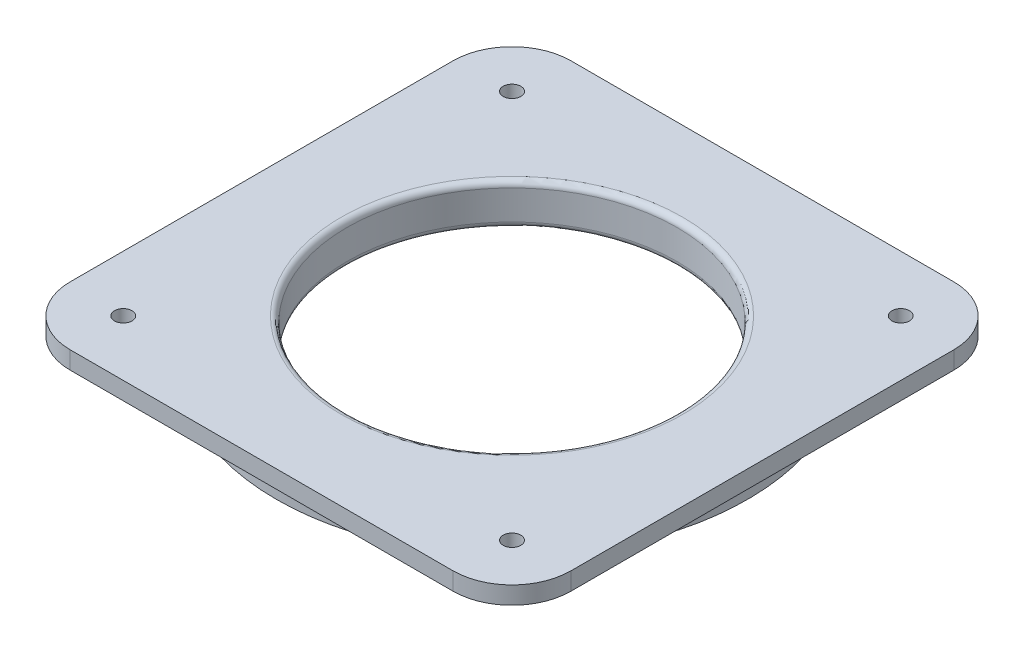
ISO-10303-21;
HEADER;
FILE_DESCRIPTION(('STEP AP214'),'2;1');
FILE_NAME('part.step','',(''),(''),'','','');
FILE_SCHEMA(('AUTOMOTIVE_DESIGN { 1 0 10303 214 1 1 1 1 }'));
ENDSEC;
DATA;
#1=APPLICATION_CONTEXT('core data for automotive mechanical design processes');
#2=APPLICATION_PROTOCOL_DEFINITION('international standard','automotive_design',2000,#1);
#3=PRODUCT_CONTEXT('',#1,'mechanical');
#4=PRODUCT('Part','Part','',(#3));
#5=PRODUCT_RELATED_PRODUCT_CATEGORY('part','',(#4));
#6=PRODUCT_DEFINITION_FORMATION('','',#4);
#7=PRODUCT_DEFINITION_CONTEXT('part definition',#1,'design');
#8=PRODUCT_DEFINITION('design','',#6,#7);
#9=PRODUCT_DEFINITION_SHAPE('','',#8);
#10=(LENGTH_UNIT() NAMED_UNIT(*) SI_UNIT(.MILLI.,.METRE.));
#11=(NAMED_UNIT(*) PLANE_ANGLE_UNIT() SI_UNIT($,.RADIAN.));
#12=(NAMED_UNIT(*) SI_UNIT($,.STERADIAN.) SOLID_ANGLE_UNIT());
#13=UNCERTAINTY_MEASURE_WITH_UNIT(LENGTH_MEASURE(1.E-05),#10,'distance_accuracy_value','');
#14=(GEOMETRIC_REPRESENTATION_CONTEXT(3) GLOBAL_UNCERTAINTY_ASSIGNED_CONTEXT((#13)) GLOBAL_UNIT_ASSIGNED_CONTEXT((#10,
#11,#12)) REPRESENTATION_CONTEXT('',''));
#15=CARTESIAN_POINT('',(0.,0.,0.));
#16=DIRECTION('',(0.,0.,1.));
#17=DIRECTION('',(1.,0.,0.));
#18=AXIS2_PLACEMENT_3D('',#15,#16,#17);
#19=CARTESIAN_POINT('',(42.5,0.,42.5));
#20=DIRECTION('',(0.,0.,1.));
#21=DIRECTION('',(1.,0.,0.));
#22=AXIS2_PLACEMENT_3D('',#19,#20,#21);
#23=PLANE('',#22);
#24=DIRECTION('',(-1.,0.,0.));
#25=VECTOR('',#24,1.);
#26=CARTESIAN_POINT('',(42.5,0.,42.5));
#27=LINE('',#26,#25);
#28=CARTESIAN_POINT('',(32.5,0.,42.5));
#29=VERTEX_POINT('',#28);
#30=CARTESIAN_POINT('',(-32.5,0.,42.5));
#31=VERTEX_POINT('',#30);
#32=EDGE_CURVE('E264',#29,#31,#27,.T.);
#33=ORIENTED_EDGE('',*,*,#32,.T.);
#34=DIRECTION('',(0.,-1.,0.));
#35=VECTOR('',#34,1.);
#36=CARTESIAN_POINT('',(-32.5,0.,42.5));
#37=LINE('',#36,#35);
#38=CARTESIAN_POINT('',(-32.5,-3.,42.5));
#39=VERTEX_POINT('',#38);
#40=EDGE_CURVE('E119',#31,#39,#37,.T.);
#41=ORIENTED_EDGE('',*,*,#40,.T.);
#42=DIRECTION('',(-1.,0.,0.));
#43=VECTOR('',#42,1.);
#44=CARTESIAN_POINT('',(42.5,-3.,42.5));
#45=LINE('',#44,#43);
#46=CARTESIAN_POINT('',(32.5,-3.,42.5));
#47=VERTEX_POINT('',#46);
#48=EDGE_CURVE('E103',#47,#39,#45,.T.);
#49=ORIENTED_EDGE('',*,*,#48,.F.);
#50=DIRECTION('',(0.,-1.,0.));
#51=VECTOR('',#50,1.);
#52=CARTESIAN_POINT('',(32.5,0.,42.5));
#53=LINE('',#52,#51);
#54=EDGE_CURVE('E116',#47,#29,#53,.F.);
#55=ORIENTED_EDGE('',*,*,#54,.T.);
#56=EDGE_LOOP('',(#33,#41,#49,#55));
#57=FACE_BOUND('',#56,.T.);
#58=ADVANCED_FACE('F33',(#57),#23,.T.);
#59=CARTESIAN_POINT('',(42.5,0.,-42.5));
#60=DIRECTION('',(1.,0.,0.));
#61=DIRECTION('',(0.,0.,-1.));
#62=AXIS2_PLACEMENT_3D('',#59,#60,#61);
#63=PLANE('',#62);
#64=DIRECTION('',(0.,0.,1.));
#65=VECTOR('',#64,1.);
#66=CARTESIAN_POINT('',(42.5,0.,-42.5));
#67=LINE('',#66,#65);
#68=CARTESIAN_POINT('',(42.5,0.,-32.5));
#69=VERTEX_POINT('',#68);
#70=CARTESIAN_POINT('',(42.5,0.,32.5));
#71=VERTEX_POINT('',#70);
#72=EDGE_CURVE('E271',#69,#71,#67,.T.);
#73=ORIENTED_EDGE('',*,*,#72,.T.);
#74=DIRECTION('',(0.,-1.,0.));
#75=VECTOR('',#74,1.);
#76=CARTESIAN_POINT('',(42.5,0.,32.5));
#77=LINE('',#76,#75);
#78=CARTESIAN_POINT('',(42.5,-3.,32.5));
#79=VERTEX_POINT('',#78);
#80=EDGE_CURVE('E151',#71,#79,#77,.T.);
#81=ORIENTED_EDGE('',*,*,#80,.T.);
#82=DIRECTION('',(0.,0.,1.));
#83=VECTOR('',#82,1.);
#84=CARTESIAN_POINT('',(42.5,-3.,-42.5));
#85=LINE('',#84,#83);
#86=CARTESIAN_POINT('',(42.5,-3.,-32.5));
#87=VERTEX_POINT('',#86);
#88=EDGE_CURVE('E105',#87,#79,#85,.T.);
#89=ORIENTED_EDGE('',*,*,#88,.F.);
#90=DIRECTION('',(0.,-1.,0.));
#91=VECTOR('',#90,1.);
#92=CARTESIAN_POINT('',(42.5,0.,-32.5));
#93=LINE('',#92,#91);
#94=EDGE_CURVE('E149',#87,#69,#93,.F.);
#95=ORIENTED_EDGE('',*,*,#94,.T.);
#96=EDGE_LOOP('',(#73,#81,#89,#95));
#97=FACE_BOUND('',#96,.T.);
#98=ADVANCED_FACE('F194',(#97),#63,.T.);
#99=CARTESIAN_POINT('',(-42.5,0.,-42.5));
#100=DIRECTION('',(0.,0.,-1.));
#101=DIRECTION('',(-1.,0.,0.));
#102=AXIS2_PLACEMENT_3D('',#99,#100,#101);
#103=PLANE('',#102);
#104=DIRECTION('',(1.,0.,0.));
#105=VECTOR('',#104,1.);
#106=CARTESIAN_POINT('',(-42.5,-3.,-42.5));
#107=LINE('',#106,#105);
#108=CARTESIAN_POINT('',(-32.5,-3.,-42.5));
#109=VERTEX_POINT('',#108);
#110=CARTESIAN_POINT('',(32.5,-3.,-42.5));
#111=VERTEX_POINT('',#110);
#112=EDGE_CURVE('E277',#109,#111,#107,.T.);
#113=ORIENTED_EDGE('',*,*,#112,.F.);
#114=DIRECTION('',(0.,-1.,0.));
#115=VECTOR('',#114,1.);
#116=CARTESIAN_POINT('',(-32.5,0.,-42.5));
#117=LINE('',#116,#115);
#118=CARTESIAN_POINT('',(-32.5,0.,-42.5));
#119=VERTEX_POINT('',#118);
#120=EDGE_CURVE('E55',#109,#119,#117,.F.);
#121=ORIENTED_EDGE('',*,*,#120,.T.);
#122=DIRECTION('',(1.,0.,0.));
#123=VECTOR('',#122,1.);
#124=CARTESIAN_POINT('',(-42.5,0.,-42.5));
#125=LINE('',#124,#123);
#126=CARTESIAN_POINT('',(32.5,0.,-42.5));
#127=VERTEX_POINT('',#126);
#128=EDGE_CURVE('E269',#119,#127,#125,.T.);
#129=ORIENTED_EDGE('',*,*,#128,.T.);
#130=DIRECTION('',(0.,-1.,0.));
#131=VECTOR('',#130,1.);
#132=CARTESIAN_POINT('',(32.5,0.,-42.5));
#133=LINE('',#132,#131);
#134=EDGE_CURVE('E153',#127,#111,#133,.T.);
#135=ORIENTED_EDGE('',*,*,#134,.T.);
#136=EDGE_LOOP('',(#113,#121,#129,#135));
#137=FACE_BOUND('',#136,.T.);
#138=ADVANCED_FACE('F199',(#137),#103,.T.);
#139=CARTESIAN_POINT('',(-42.5,0.,42.5));
#140=DIRECTION('',(-1.,0.,0.));
#141=DIRECTION('',(0.,0.,1.));
#142=AXIS2_PLACEMENT_3D('',#139,#140,#141);
#143=PLANE('',#142);
#144=DIRECTION('',(0.,0.,-1.));
#145=VECTOR('',#144,1.);
#146=CARTESIAN_POINT('',(-42.5,-3.,42.5));
#147=LINE('',#146,#145);
#148=CARTESIAN_POINT('',(-42.5,-3.,32.5));
#149=VERTEX_POINT('',#148);
#150=CARTESIAN_POINT('',(-42.5,-3.,-32.5));
#151=VERTEX_POINT('',#150);
#152=EDGE_CURVE('E120',#149,#151,#147,.T.);
#153=ORIENTED_EDGE('',*,*,#152,.F.);
#154=DIRECTION('',(0.,-1.,0.));
#155=VECTOR('',#154,1.);
#156=CARTESIAN_POINT('',(-42.5,0.,32.5));
#157=LINE('',#156,#155);
#158=CARTESIAN_POINT('',(-42.5,0.,32.5));
#159=VERTEX_POINT('',#158);
#160=EDGE_CURVE('E141',#149,#159,#157,.F.);
#161=ORIENTED_EDGE('',*,*,#160,.T.);
#162=DIRECTION('',(0.,0.,-1.));
#163=VECTOR('',#162,1.);
#164=CARTESIAN_POINT('',(-42.5,0.,42.5));
#165=LINE('',#164,#163);
#166=CARTESIAN_POINT('',(-42.5,0.,-32.5));
#167=VERTEX_POINT('',#166);
#168=EDGE_CURVE('E266',#159,#167,#165,.T.);
#169=ORIENTED_EDGE('',*,*,#168,.T.);
#170=DIRECTION('',(0.,-1.,0.));
#171=VECTOR('',#170,1.);
#172=CARTESIAN_POINT('',(-42.5,0.,-32.5));
#173=LINE('',#172,#171);
#174=EDGE_CURVE('E138',#167,#151,#173,.T.);
#175=ORIENTED_EDGE('',*,*,#174,.T.);
#176=EDGE_LOOP('',(#153,#161,#169,#175));
#177=FACE_BOUND('',#176,.T.);
#178=ADVANCED_FACE('F204',(#177),#143,.T.);
#179=CARTESIAN_POINT('',(0.,0.,0.));
#180=DIRECTION('',(0.,-1.,0.));
#181=DIRECTION('',(0.,0.,-1.));
#182=AXIS2_PLACEMENT_3D('',#179,#180,#181);
#183=PLANE('',#182);
#184=CARTESIAN_POINT('',(33.,0.,-33.));
#185=DIRECTION('',(0.,-1.,0.));
#186=DIRECTION('',(0.,0.,-1.));
#187=AXIS2_PLACEMENT_3D('',#184,#185,#186);
#188=CIRCLE('',#187,1.50000000000002);
#189=CARTESIAN_POINT('',(33.,0.,-34.5));
#190=VERTEX_POINT('',#189);
#191=EDGE_CURVE('E249',#190,#190,#188,.T.);
#192=ORIENTED_EDGE('',*,*,#191,.T.);
#193=EDGE_LOOP('',(#192));
#194=FACE_BOUND('',#193,.T.);
#195=CARTESIAN_POINT('',(-33.,0.,33.));
#196=DIRECTION('',(0.,-1.,0.));
#197=DIRECTION('',(0.,0.,-1.));
#198=AXIS2_PLACEMENT_3D('',#195,#196,#197);
#199=CIRCLE('',#198,1.50000000000003);
#200=CARTESIAN_POINT('',(-33.,0.,31.5));
#201=VERTEX_POINT('',#200);
#202=EDGE_CURVE('E247',#201,#201,#199,.T.);
#203=ORIENTED_EDGE('',*,*,#202,.T.);
#204=EDGE_LOOP('',(#203));
#205=FACE_BOUND('',#204,.T.);
#206=CARTESIAN_POINT('',(-33.,0.,-33.));
#207=DIRECTION('',(0.,-1.,0.));
#208=DIRECTION('',(0.,0.,-1.));
#209=AXIS2_PLACEMENT_3D('',#206,#207,#208);
#210=CIRCLE('',#209,1.50000000000003);
#211=CARTESIAN_POINT('',(-33.,0.,-34.5));
#212=VERTEX_POINT('',#211);
#213=EDGE_CURVE('E250',#212,#212,#210,.T.);
#214=ORIENTED_EDGE('',*,*,#213,.T.);
#215=EDGE_LOOP('',(#214));
#216=FACE_BOUND('',#215,.T.);
#217=CARTESIAN_POINT('',(33.,0.,33.));
#218=DIRECTION('',(0.,-1.,0.));
#219=DIRECTION('',(0.,0.,-1.));
#220=AXIS2_PLACEMENT_3D('',#217,#218,#219);
#221=CIRCLE('',#220,1.5);
#222=CARTESIAN_POINT('',(33.,0.,31.5));
#223=VERTEX_POINT('',#222);
#224=EDGE_CURVE('E256',#223,#223,#221,.T.);
#225=ORIENTED_EDGE('',*,*,#224,.T.);
#226=EDGE_LOOP('',(#225));
#227=FACE_BOUND('',#226,.T.);
#228=CARTESIAN_POINT('',(0.,0.,0.));
#229=DIRECTION('',(0.,-1.,0.));
#230=DIRECTION('',(0.,0.,-1.));
#231=AXIS2_PLACEMENT_3D('',#228,#229,#230);
#232=CIRCLE('',#231,29.);
#233=CARTESIAN_POINT('',(0.,0.,-29.));
#234=VERTEX_POINT('',#233);
#235=EDGE_CURVE('E131',#234,#234,#232,.T.);
#236=ORIENTED_EDGE('',*,*,#235,.T.);
#237=EDGE_LOOP('',(#236));
#238=FACE_BOUND('',#237,.T.);
#239=ORIENTED_EDGE('',*,*,#168,.F.);
#240=CARTESIAN_POINT('',(-32.5,0.,32.5));
#241=DIRECTION('',(0.,-1.,0.));
#242=DIRECTION('',(0.,0.,-1.));
#243=AXIS2_PLACEMENT_3D('',#240,#241,#242);
#244=CIRCLE('',#243,10.);
#245=EDGE_CURVE('E147',#159,#31,#244,.F.);
#246=ORIENTED_EDGE('',*,*,#245,.T.);
#247=ORIENTED_EDGE('',*,*,#32,.F.);
#248=CARTESIAN_POINT('',(32.5,0.,32.5));
#249=DIRECTION('',(0.,-1.,0.));
#250=DIRECTION('',(0.,0.,-1.));
#251=AXIS2_PLACEMENT_3D('',#248,#249,#250);
#252=CIRCLE('',#251,10.);
#253=EDGE_CURVE('E125',#29,#71,#252,.F.);
#254=ORIENTED_EDGE('',*,*,#253,.T.);
#255=ORIENTED_EDGE('',*,*,#72,.F.);
#256=CARTESIAN_POINT('',(32.5,0.,-32.5));
#257=DIRECTION('',(0.,-1.,0.));
#258=DIRECTION('',(0.,0.,-1.));
#259=AXIS2_PLACEMENT_3D('',#256,#257,#258);
#260=CIRCLE('',#259,10.);
#261=EDGE_CURVE('E48',#69,#127,#260,.F.);
#262=ORIENTED_EDGE('',*,*,#261,.T.);
#263=ORIENTED_EDGE('',*,*,#128,.F.);
#264=CARTESIAN_POINT('',(-32.5,0.,-32.5));
#265=DIRECTION('',(0.,-1.,0.));
#266=DIRECTION('',(0.,0.,-1.));
#267=AXIS2_PLACEMENT_3D('',#264,#265,#266);
#268=CIRCLE('',#267,10.);
#269=EDGE_CURVE('E144',#119,#167,#268,.F.);
#270=ORIENTED_EDGE('',*,*,#269,.T.);
#271=EDGE_LOOP('',(#239,#246,#247,#254,#255,#262,#263,#270));
#272=FACE_BOUND('',#271,.T.);
#273=ADVANCED_FACE('F288',(#194,#205,#216,#227,#238,#272),#183,.F.);
#274=CARTESIAN_POINT('',(0.,-3.,0.));
#275=DIRECTION('',(0.,-1.,0.));
#276=DIRECTION('',(0.,0.,-1.));
#277=AXIS2_PLACEMENT_3D('',#274,#275,#276);
#278=PLANE('',#277);
#279=CARTESIAN_POINT('',(-33.,-3.,33.));
#280=DIRECTION('',(0.,-1.,0.));
#281=DIRECTION('',(0.,0.,-1.));
#282=AXIS2_PLACEMENT_3D('',#279,#280,#281);
#283=CIRCLE('',#282,2.00000000000003);
#284=CARTESIAN_POINT('',(-33.,-3.,31.));
#285=VERTEX_POINT('',#284);
#286=EDGE_CURVE('E169',#285,#285,#283,.F.);
#287=ORIENTED_EDGE('',*,*,#286,.T.);
#288=EDGE_LOOP('',(#287));
#289=FACE_BOUND('',#288,.T.);
#290=CARTESIAN_POINT('',(-33.,-3.,-33.));
#291=DIRECTION('',(0.,-1.,0.));
#292=DIRECTION('',(0.,0.,-1.));
#293=AXIS2_PLACEMENT_3D('',#290,#291,#292);
#294=CIRCLE('',#293,2.00000000000003);
#295=CARTESIAN_POINT('',(-33.,-3.,-35.));
#296=VERTEX_POINT('',#295);
#297=EDGE_CURVE('E166',#296,#296,#294,.F.);
#298=ORIENTED_EDGE('',*,*,#297,.T.);
#299=EDGE_LOOP('',(#298));
#300=FACE_BOUND('',#299,.T.);
#301=CARTESIAN_POINT('',(33.,-3.,-33.));
#302=DIRECTION('',(0.,-1.,0.));
#303=DIRECTION('',(0.,0.,-1.));
#304=AXIS2_PLACEMENT_3D('',#301,#302,#303);
#305=CIRCLE('',#304,2.00000000000002);
#306=CARTESIAN_POINT('',(33.,-3.,-35.));
#307=VERTEX_POINT('',#306);
#308=EDGE_CURVE('E163',#307,#307,#305,.F.);
#309=ORIENTED_EDGE('',*,*,#308,.T.);
#310=EDGE_LOOP('',(#309));
#311=FACE_BOUND('',#310,.T.);
#312=CARTESIAN_POINT('',(33.,-3.,33.));
#313=DIRECTION('',(0.,-1.,0.));
#314=DIRECTION('',(0.,0.,-1.));
#315=AXIS2_PLACEMENT_3D('',#312,#313,#314);
#316=CIRCLE('',#315,2.);
#317=CARTESIAN_POINT('',(33.,-3.,31.));
#318=VERTEX_POINT('',#317);
#319=EDGE_CURVE('E160',#318,#318,#316,.F.);
#320=ORIENTED_EDGE('',*,*,#319,.T.);
#321=EDGE_LOOP('',(#320));
#322=FACE_BOUND('',#321,.T.);
#323=CARTESIAN_POINT('',(0.,-3.,0.));
#324=DIRECTION('',(0.,1.,0.));
#325=DIRECTION('',(0.,0.,1.));
#326=AXIS2_PLACEMENT_3D('',#323,#324,#325);
#327=CIRCLE('',#326,40.);
#328=CARTESIAN_POINT('',(0.,-3.,40.));
#329=VERTEX_POINT('',#328);
#330=EDGE_CURVE('E253',#329,#329,#327,.T.);
#331=ORIENTED_EDGE('',*,*,#330,.T.);
#332=EDGE_LOOP('',(#331));
#333=FACE_BOUND('',#332,.T.);
#334=ORIENTED_EDGE('',*,*,#48,.T.);
#335=CARTESIAN_POINT('',(-32.5,-3.,32.5));
#336=DIRECTION('',(0.,-1.,0.));
#337=DIRECTION('',(0.,0.,-1.));
#338=AXIS2_PLACEMENT_3D('',#335,#336,#337);
#339=CIRCLE('',#338,10.);
#340=EDGE_CURVE('E110',#39,#149,#339,.T.);
#341=ORIENTED_EDGE('',*,*,#340,.T.);
#342=ORIENTED_EDGE('',*,*,#152,.T.);
#343=CARTESIAN_POINT('',(-32.5,-3.,-32.5));
#344=DIRECTION('',(0.,-1.,0.));
#345=DIRECTION('',(0.,0.,-1.));
#346=AXIS2_PLACEMENT_3D('',#343,#344,#345);
#347=CIRCLE('',#346,10.);
#348=EDGE_CURVE('E111',#151,#109,#347,.T.);
#349=ORIENTED_EDGE('',*,*,#348,.T.);
#350=ORIENTED_EDGE('',*,*,#112,.T.);
#351=CARTESIAN_POINT('',(32.5,-3.,-32.5));
#352=DIRECTION('',(0.,-1.,0.));
#353=DIRECTION('',(0.,0.,-1.));
#354=AXIS2_PLACEMENT_3D('',#351,#352,#353);
#355=CIRCLE('',#354,10.);
#356=EDGE_CURVE('E128',#111,#87,#355,.T.);
#357=ORIENTED_EDGE('',*,*,#356,.T.);
#358=ORIENTED_EDGE('',*,*,#88,.T.);
#359=CARTESIAN_POINT('',(32.5,-3.,32.5));
#360=DIRECTION('',(0.,-1.,0.));
#361=DIRECTION('',(0.,0.,-1.));
#362=AXIS2_PLACEMENT_3D('',#359,#360,#361);
#363=CIRCLE('',#362,10.);
#364=EDGE_CURVE('E100',#79,#47,#363,.T.);
#365=ORIENTED_EDGE('',*,*,#364,.T.);
#366=EDGE_LOOP('',(#334,#341,#342,#349,#350,#357,#358,#365));
#367=FACE_BOUND('',#366,.T.);
#368=ADVANCED_FACE('F102',(#289,#300,#311,#322,#333,#367),#278,.T.);
#369=CARTESIAN_POINT('',(0.,-7.,0.));
#370=DIRECTION('',(0.,1.,0.));
#371=DIRECTION('',(0.,0.,1.));
#372=AXIS2_PLACEMENT_3D('',#369,#370,#371);
#373=CYLINDRICAL_SURFACE('',#372,40.);
#374=CARTESIAN_POINT('',(0.,-7.,0.));
#375=DIRECTION('',(0.,1.,0.));
#376=DIRECTION('',(0.,0.,1.));
#377=AXIS2_PLACEMENT_3D('',#374,#375,#376);
#378=CIRCLE('',#377,40.);
#379=CARTESIAN_POINT('',(0.,-7.,40.));
#380=VERTEX_POINT('',#379);
#381=EDGE_CURVE('E121',#380,#380,#378,.T.);
#382=ORIENTED_EDGE('',*,*,#381,.T.);
#383=EDGE_LOOP('',(#382));
#384=FACE_BOUND('',#383,.T.);
#385=ORIENTED_EDGE('',*,*,#330,.F.);
#386=EDGE_LOOP('',(#385));
#387=FACE_BOUND('',#386,.T.);
#388=ADVANCED_FACE('F302',(#384,#387),#373,.T.);
#389=CARTESIAN_POINT('',(40.,-7.,0.));
#390=DIRECTION('',(0.,-1.,0.));
#391=DIRECTION('',(0.,0.,-1.));
#392=AXIS2_PLACEMENT_3D('',#389,#390,#391);
#393=PLANE('',#392);
#394=CARTESIAN_POINT('',(0.,-7.,0.));
#395=DIRECTION('',(0.,-1.,0.));
#396=DIRECTION('',(0.,0.,-1.));
#397=AXIS2_PLACEMENT_3D('',#394,#395,#396);
#398=CIRCLE('',#397,29.);
#399=CARTESIAN_POINT('',(0.,-7.,-29.));
#400=VERTEX_POINT('',#399);
#401=EDGE_CURVE('E126',#400,#400,#398,.F.);
#402=ORIENTED_EDGE('',*,*,#401,.T.);
#403=EDGE_LOOP('',(#402));
#404=FACE_BOUND('',#403,.T.);
#405=ORIENTED_EDGE('',*,*,#381,.F.);
#406=EDGE_LOOP('',(#405));
#407=FACE_BOUND('',#406,.T.);
#408=ADVANCED_FACE('F294',(#404,#407),#393,.T.);
#409=CARTESIAN_POINT('',(0.,0.,0.));
#410=DIRECTION('',(0.,1.,0.));
#411=DIRECTION('',(0.,0.,1.));
#412=AXIS2_PLACEMENT_3D('',#409,#410,#411);
#413=CYLINDRICAL_SURFACE('',#412,28.);
#414=CARTESIAN_POINT('',(0.,-1.,0.));
#415=DIRECTION('',(0.,-1.,0.));
#416=DIRECTION('',(0.,0.,-1.));
#417=AXIS2_PLACEMENT_3D('',#414,#415,#416);
#418=CIRCLE('',#417,28.);
#419=CARTESIAN_POINT('',(0.,-1.,-28.));
#420=VERTEX_POINT('',#419);
#421=EDGE_CURVE('E283',#420,#420,#418,.F.);
#422=ORIENTED_EDGE('',*,*,#421,.T.);
#423=EDGE_LOOP('',(#422));
#424=FACE_BOUND('',#423,.T.);
#425=CARTESIAN_POINT('',(0.,-6.,0.));
#426=DIRECTION('',(0.,-1.,0.));
#427=DIRECTION('',(0.,0.,-1.));
#428=AXIS2_PLACEMENT_3D('',#425,#426,#427);
#429=CIRCLE('',#428,28.);
#430=CARTESIAN_POINT('',(0.,-6.,-28.));
#431=VERTEX_POINT('',#430);
#432=EDGE_CURVE('E273',#431,#431,#429,.T.);
#433=ORIENTED_EDGE('',*,*,#432,.T.);
#434=EDGE_LOOP('',(#433));
#435=FACE_BOUND('',#434,.T.);
#436=ADVANCED_FACE('F210',(#424,#435),#413,.F.);
#437=CARTESIAN_POINT('',(0.,-1.,0.));
#438=DIRECTION('',(0.,-1.,0.));
#439=DIRECTION('',(0.,0.,-1.));
#440=AXIS2_PLACEMENT_3D('',#437,#438,#439);
#441=TOROIDAL_SURFACE('',#440,29.,1.);
#442=ORIENTED_EDGE('',*,*,#235,.F.);
#443=EDGE_LOOP('',(#442));
#444=FACE_BOUND('',#443,.T.);
#445=ORIENTED_EDGE('',*,*,#421,.F.);
#446=EDGE_LOOP('',(#445));
#447=FACE_BOUND('',#446,.T.);
#448=ADVANCED_FACE('F206',(#444,#447),#441,.T.);
#449=CARTESIAN_POINT('',(0.,-6.,0.));
#450=DIRECTION('',(0.,-1.,0.));
#451=DIRECTION('',(0.,0.,-1.));
#452=AXIS2_PLACEMENT_3D('',#449,#450,#451);
#453=TOROIDAL_SURFACE('',#452,29.,1.);
#454=ORIENTED_EDGE('',*,*,#432,.F.);
#455=EDGE_LOOP('',(#454));
#456=FACE_BOUND('',#455,.T.);
#457=ORIENTED_EDGE('',*,*,#401,.F.);
#458=EDGE_LOOP('',(#457));
#459=FACE_BOUND('',#458,.T.);
#460=ADVANCED_FACE('F209',(#456,#459),#453,.T.);
#461=CARTESIAN_POINT('',(-32.5,0.,32.5));
#462=DIRECTION('',(0.,-1.,0.));
#463=DIRECTION('',(0.,0.,-1.));
#464=AXIS2_PLACEMENT_3D('',#461,#462,#463);
#465=CYLINDRICAL_SURFACE('',#464,10.);
#466=ORIENTED_EDGE('',*,*,#245,.F.);
#467=ORIENTED_EDGE('',*,*,#160,.F.);
#468=ORIENTED_EDGE('',*,*,#340,.F.);
#469=ORIENTED_EDGE('',*,*,#40,.F.);
#470=EDGE_LOOP('',(#466,#467,#468,#469));
#471=FACE_BOUND('',#470,.T.);
#472=ADVANCED_FACE('F214',(#471),#465,.T.);
#473=CARTESIAN_POINT('',(32.5,0.,32.5));
#474=DIRECTION('',(0.,-1.,0.));
#475=DIRECTION('',(0.,0.,-1.));
#476=AXIS2_PLACEMENT_3D('',#473,#474,#475);
#477=CYLINDRICAL_SURFACE('',#476,10.);
#478=ORIENTED_EDGE('',*,*,#253,.F.);
#479=ORIENTED_EDGE('',*,*,#54,.F.);
#480=ORIENTED_EDGE('',*,*,#364,.F.);
#481=ORIENTED_EDGE('',*,*,#80,.F.);
#482=EDGE_LOOP('',(#478,#479,#480,#481));
#483=FACE_BOUND('',#482,.T.);
#484=ADVANCED_FACE('F124',(#483),#477,.T.);
#485=CARTESIAN_POINT('',(-32.5,0.,-32.5));
#486=DIRECTION('',(0.,-1.,0.));
#487=DIRECTION('',(0.,0.,-1.));
#488=AXIS2_PLACEMENT_3D('',#485,#486,#487);
#489=CYLINDRICAL_SURFACE('',#488,10.);
#490=ORIENTED_EDGE('',*,*,#269,.F.);
#491=ORIENTED_EDGE('',*,*,#120,.F.);
#492=ORIENTED_EDGE('',*,*,#348,.F.);
#493=ORIENTED_EDGE('',*,*,#174,.F.);
#494=EDGE_LOOP('',(#490,#491,#492,#493));
#495=FACE_BOUND('',#494,.T.);
#496=ADVANCED_FACE('F221',(#495),#489,.T.);
#497=CARTESIAN_POINT('',(32.5,0.,-32.5));
#498=DIRECTION('',(0.,-1.,0.));
#499=DIRECTION('',(0.,0.,-1.));
#500=AXIS2_PLACEMENT_3D('',#497,#498,#499);
#501=CYLINDRICAL_SURFACE('',#500,10.);
#502=ORIENTED_EDGE('',*,*,#261,.F.);
#503=ORIENTED_EDGE('',*,*,#94,.F.);
#504=ORIENTED_EDGE('',*,*,#356,.F.);
#505=ORIENTED_EDGE('',*,*,#134,.F.);
#506=EDGE_LOOP('',(#502,#503,#504,#505));
#507=FACE_BOUND('',#506,.T.);
#508=ADVANCED_FACE('F224',(#507),#501,.T.);
#509=CARTESIAN_POINT('',(33.,7.,33.));
#510=DIRECTION('',(0.,-1.,0.));
#511=DIRECTION('',(0.,0.,-1.));
#512=AXIS2_PLACEMENT_3D('',#509,#510,#511);
#513=CYLINDRICAL_SURFACE('',#512,1.5);
#514=CARTESIAN_POINT('',(33.,-2.5,33.));
#515=DIRECTION('',(0.,-1.,0.));
#516=DIRECTION('',(0.,0.,-1.));
#517=AXIS2_PLACEMENT_3D('',#514,#515,#516);
#518=CIRCLE('',#517,1.5);
#519=CARTESIAN_POINT('',(33.,-2.5,31.5));
#520=VERTEX_POINT('',#519);
#521=EDGE_CURVE('E11',#520,#520,#518,.T.);
#522=ORIENTED_EDGE('',*,*,#521,.T.);
#523=EDGE_LOOP('',(#522));
#524=FACE_BOUND('',#523,.T.);
#525=ORIENTED_EDGE('',*,*,#224,.F.);
#526=EDGE_LOOP('',(#525));
#527=FACE_BOUND('',#526,.T.);
#528=ADVANCED_FACE('F228',(#524,#527),#513,.F.);
#529=CARTESIAN_POINT('',(-33.,7.,-33.));
#530=DIRECTION('',(0.,-1.,0.));
#531=DIRECTION('',(0.,0.,-1.));
#532=AXIS2_PLACEMENT_3D('',#529,#530,#531);
#533=CYLINDRICAL_SURFACE('',#532,1.50000000000003);
#534=CARTESIAN_POINT('',(-33.,-2.5,-33.));
#535=DIRECTION('',(0.,-1.,0.));
#536=DIRECTION('',(0.,0.,-1.));
#537=AXIS2_PLACEMENT_3D('',#534,#535,#536);
#538=CIRCLE('',#537,1.50000000000003);
#539=CARTESIAN_POINT('',(-33.,-2.5,-34.5));
#540=VERTEX_POINT('',#539);
#541=EDGE_CURVE('E172',#540,#540,#538,.T.);
#542=ORIENTED_EDGE('',*,*,#541,.T.);
#543=EDGE_LOOP('',(#542));
#544=FACE_BOUND('',#543,.T.);
#545=ORIENTED_EDGE('',*,*,#213,.F.);
#546=EDGE_LOOP('',(#545));
#547=FACE_BOUND('',#546,.T.);
#548=ADVANCED_FACE('F243',(#544,#547),#533,.F.);
#549=CARTESIAN_POINT('',(-33.,7.,33.));
#550=DIRECTION('',(0.,-1.,0.));
#551=DIRECTION('',(0.,0.,-1.));
#552=AXIS2_PLACEMENT_3D('',#549,#550,#551);
#553=CYLINDRICAL_SURFACE('',#552,1.50000000000003);
#554=CARTESIAN_POINT('',(-33.,-2.5,33.));
#555=DIRECTION('',(0.,-1.,0.));
#556=DIRECTION('',(0.,0.,-1.));
#557=AXIS2_PLACEMENT_3D('',#554,#555,#556);
#558=CIRCLE('',#557,1.50000000000003);
#559=CARTESIAN_POINT('',(-33.,-2.5,31.5));
#560=VERTEX_POINT('',#559);
#561=EDGE_CURVE('E157',#560,#560,#558,.T.);
#562=ORIENTED_EDGE('',*,*,#561,.T.);
#563=EDGE_LOOP('',(#562));
#564=FACE_BOUND('',#563,.T.);
#565=ORIENTED_EDGE('',*,*,#202,.F.);
#566=EDGE_LOOP('',(#565));
#567=FACE_BOUND('',#566,.T.);
#568=ADVANCED_FACE('F235',(#564,#567),#553,.F.);
#569=CARTESIAN_POINT('',(33.,7.,-33.));
#570=DIRECTION('',(0.,-1.,0.));
#571=DIRECTION('',(0.,0.,-1.));
#572=AXIS2_PLACEMENT_3D('',#569,#570,#571);
#573=CYLINDRICAL_SURFACE('',#572,1.50000000000002);
#574=CARTESIAN_POINT('',(33.,-2.5,-33.));
#575=DIRECTION('',(0.,-1.,0.));
#576=DIRECTION('',(0.,0.,-1.));
#577=AXIS2_PLACEMENT_3D('',#574,#575,#576);
#578=CIRCLE('',#577,1.50000000000002);
#579=CARTESIAN_POINT('',(33.,-2.5,-34.5));
#580=VERTEX_POINT('',#579);
#581=EDGE_CURVE('E41',#580,#580,#578,.T.);
#582=ORIENTED_EDGE('',*,*,#581,.T.);
#583=EDGE_LOOP('',(#582));
#584=FACE_BOUND('',#583,.T.);
#585=ORIENTED_EDGE('',*,*,#191,.F.);
#586=EDGE_LOOP('',(#585));
#587=FACE_BOUND('',#586,.T.);
#588=ADVANCED_FACE('F177',(#584,#587),#573,.F.);
#589=CARTESIAN_POINT('',(-33.,-2.5,33.));
#590=DIRECTION('',(0.,-1.,0.));
#591=DIRECTION('',(0.,0.,-1.));
#592=AXIS2_PLACEMENT_3D('',#589,#590,#591);
#593=TOROIDAL_SURFACE('',#592,2.00000000000003,0.5);
#594=ORIENTED_EDGE('',*,*,#286,.F.);
#595=EDGE_LOOP('',(#594));
#596=FACE_BOUND('',#595,.T.);
#597=ORIENTED_EDGE('',*,*,#561,.F.);
#598=EDGE_LOOP('',(#597));
#599=FACE_BOUND('',#598,.T.);
#600=ADVANCED_FACE('F189',(#596,#599),#593,.T.);
#601=CARTESIAN_POINT('',(-33.,-2.5,-33.));
#602=DIRECTION('',(0.,-1.,0.));
#603=DIRECTION('',(0.,0.,-1.));
#604=AXIS2_PLACEMENT_3D('',#601,#602,#603);
#605=TOROIDAL_SURFACE('',#604,2.00000000000003,0.5);
#606=ORIENTED_EDGE('',*,*,#297,.F.);
#607=EDGE_LOOP('',(#606));
#608=FACE_BOUND('',#607,.T.);
#609=ORIENTED_EDGE('',*,*,#541,.F.);
#610=EDGE_LOOP('',(#609));
#611=FACE_BOUND('',#610,.T.);
#612=ADVANCED_FACE('F182',(#608,#611),#605,.T.);
#613=CARTESIAN_POINT('',(33.,-2.5,-33.));
#614=DIRECTION('',(0.,-1.,0.));
#615=DIRECTION('',(0.,0.,-1.));
#616=AXIS2_PLACEMENT_3D('',#613,#614,#615);
#617=TOROIDAL_SURFACE('',#616,2.00000000000002,0.5);
#618=ORIENTED_EDGE('',*,*,#308,.F.);
#619=EDGE_LOOP('',(#618));
#620=FACE_BOUND('',#619,.T.);
#621=ORIENTED_EDGE('',*,*,#581,.F.);
#622=EDGE_LOOP('',(#621));
#623=FACE_BOUND('',#622,.T.);
#624=ADVANCED_FACE('F180',(#620,#623),#617,.T.);
#625=CARTESIAN_POINT('',(33.,-2.5,33.));
#626=DIRECTION('',(0.,-1.,0.));
#627=DIRECTION('',(0.,0.,-1.));
#628=AXIS2_PLACEMENT_3D('',#625,#626,#627);
#629=TOROIDAL_SURFACE('',#628,2.,0.5);
#630=ORIENTED_EDGE('',*,*,#319,.F.);
#631=EDGE_LOOP('',(#630));
#632=FACE_BOUND('',#631,.T.);
#633=ORIENTED_EDGE('',*,*,#521,.F.);
#634=EDGE_LOOP('',(#633));
#635=FACE_BOUND('',#634,.T.);
#636=ADVANCED_FACE('F35',(#632,#635),#629,.T.);
#637=CLOSED_SHELL('',(#58,#98,#138,#178,#273,#368,#388,#408,#436,#448,#460,#472,#484,#496,#508,
#528,#548,#568,#588,#600,#612,#624,#636));
#638=MANIFOLD_SOLID_BREP('B2',#637);
#639=ADVANCED_BREP_SHAPE_REPRESENTATION('',(#18,#638),#14);
#640=SHAPE_DEFINITION_REPRESENTATION(#9,#639);
ENDSEC;
END-ISO-10303-21;
